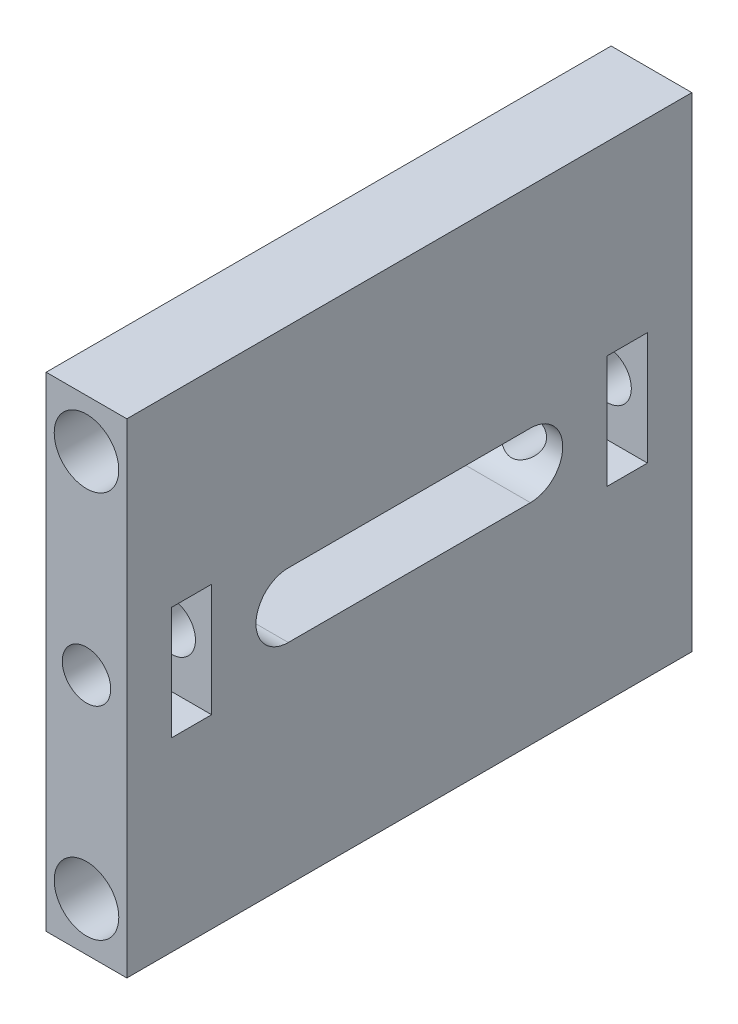
ISO-10303-21;
HEADER;
FILE_DESCRIPTION(('STEP AP214'),'2;1');
FILE_NAME('part.step','',(''),(''),'','','');
FILE_SCHEMA(('AUTOMOTIVE_DESIGN { 1 0 10303 214 1 1 1 1 }'));
ENDSEC;
DATA;
#1=APPLICATION_CONTEXT('core data for automotive mechanical design processes');
#2=APPLICATION_PROTOCOL_DEFINITION('international standard','automotive_design',2000,#1);
#3=PRODUCT_CONTEXT('',#1,'mechanical');
#4=PRODUCT('Part','Part','',(#3));
#5=PRODUCT_RELATED_PRODUCT_CATEGORY('part','',(#4));
#6=PRODUCT_DEFINITION_FORMATION('','',#4);
#7=PRODUCT_DEFINITION_CONTEXT('part definition',#1,'design');
#8=PRODUCT_DEFINITION('design','',#6,#7);
#9=PRODUCT_DEFINITION_SHAPE('','',#8);
#10=(LENGTH_UNIT() NAMED_UNIT(*) SI_UNIT(.MILLI.,.METRE.));
#11=(NAMED_UNIT(*) PLANE_ANGLE_UNIT() SI_UNIT($,.RADIAN.));
#12=(NAMED_UNIT(*) SI_UNIT($,.STERADIAN.) SOLID_ANGLE_UNIT());
#13=UNCERTAINTY_MEASURE_WITH_UNIT(LENGTH_MEASURE(1.E-05),#10,'distance_accuracy_value','');
#14=(GEOMETRIC_REPRESENTATION_CONTEXT(3) GLOBAL_UNCERTAINTY_ASSIGNED_CONTEXT((#13)) GLOBAL_UNIT_ASSIGNED_CONTEXT((#10,
#11,#12)) REPRESENTATION_CONTEXT('',''));
#15=CARTESIAN_POINT('',(0.,0.,0.));
#16=DIRECTION('',(0.,0.,1.));
#17=DIRECTION('',(1.,0.,0.));
#18=AXIS2_PLACEMENT_3D('',#15,#16,#17);
#19=CARTESIAN_POINT('',(2.5,-15.,35.));
#20=DIRECTION('',(-1.,0.,0.));
#21=DIRECTION('',(0.,0.,1.));
#22=AXIS2_PLACEMENT_3D('',#19,#20,#21);
#23=PLANE('',#22);
#24=DIRECTION('',(0.,1.,0.));
#25=VECTOR('',#24,1.);
#26=CARTESIAN_POINT('',(2.5,-15.,0.));
#27=LINE('',#26,#25);
#28=CARTESIAN_POINT('',(2.5,-15.,0.));
#29=VERTEX_POINT('',#28);
#30=CARTESIAN_POINT('',(2.5,15.,0.));
#31=VERTEX_POINT('',#30);
#32=EDGE_CURVE('E277',#29,#31,#27,.T.);
#33=ORIENTED_EDGE('',*,*,#32,.T.);
#34=DIRECTION('',(0.,0.,-1.));
#35=VECTOR('',#34,1.);
#36=CARTESIAN_POINT('',(2.5,15.,35.));
#37=LINE('',#36,#35);
#38=CARTESIAN_POINT('',(2.5,15.,35.));
#39=VERTEX_POINT('',#38);
#40=EDGE_CURVE('E247',#39,#31,#37,.T.);
#41=ORIENTED_EDGE('',*,*,#40,.F.);
#42=DIRECTION('',(0.,1.,0.));
#43=VECTOR('',#42,1.);
#44=CARTESIAN_POINT('',(2.5,-15.,35.));
#45=LINE('',#44,#43);
#46=CARTESIAN_POINT('',(2.5,-15.,35.));
#47=VERTEX_POINT('',#46);
#48=EDGE_CURVE('E362',#47,#39,#45,.T.);
#49=ORIENTED_EDGE('',*,*,#48,.F.);
#50=DIRECTION('',(0.,0.,-1.));
#51=VECTOR('',#50,1.);
#52=CARTESIAN_POINT('',(2.5,-15.,35.));
#53=LINE('',#52,#51);
#54=EDGE_CURVE('E378',#47,#29,#53,.T.);
#55=ORIENTED_EDGE('',*,*,#54,.T.);
#56=EDGE_LOOP('',(#33,#41,#49,#55));
#57=FACE_BOUND('',#56,.T.);
#58=DIRECTION('',(0.,0.,1.));
#59=VECTOR('',#58,1.);
#60=CARTESIAN_POINT('',(2.5,2.,10.));
#61=LINE('',#60,#59);
#62=CARTESIAN_POINT('',(2.5,2.,10.));
#63=VERTEX_POINT('',#62);
#64=CARTESIAN_POINT('',(2.5,1.99999999999999,25.));
#65=VERTEX_POINT('',#64);
#66=EDGE_CURVE('E282',#63,#65,#61,.T.);
#67=ORIENTED_EDGE('',*,*,#66,.F.);
#68=CARTESIAN_POINT('',(2.5,0.,10.));
#69=DIRECTION('',(1.,0.,0.));
#70=DIRECTION('',(0.,0.,-1.));
#71=AXIS2_PLACEMENT_3D('',#68,#69,#70);
#72=CIRCLE('',#71,2.);
#73=CARTESIAN_POINT('',(2.5,-2.,10.));
#74=VERTEX_POINT('',#73);
#75=EDGE_CURVE('E410',#74,#63,#72,.T.);
#76=ORIENTED_EDGE('',*,*,#75,.F.);
#77=DIRECTION('',(0.,0.,-1.));
#78=VECTOR('',#77,1.);
#79=CARTESIAN_POINT('',(2.5,-2.,10.));
#80=LINE('',#79,#78);
#81=CARTESIAN_POINT('',(2.5,-2.00000000000001,25.));
#82=VERTEX_POINT('',#81);
#83=EDGE_CURVE('E402',#82,#74,#80,.T.);
#84=ORIENTED_EDGE('',*,*,#83,.F.);
#85=CARTESIAN_POINT('',(2.5,0.,25.));
#86=DIRECTION('',(1.,0.,0.));
#87=DIRECTION('',(0.,0.,-1.));
#88=AXIS2_PLACEMENT_3D('',#85,#86,#87);
#89=CIRCLE('',#88,2.);
#90=EDGE_CURVE('E406',#65,#82,#89,.T.);
#91=ORIENTED_EDGE('',*,*,#90,.F.);
#92=EDGE_LOOP('',(#67,#76,#84,#91));
#93=FACE_BOUND('',#92,.T.);
#94=DIRECTION('',(0.,0.,-1.));
#95=VECTOR('',#94,1.);
#96=CARTESIAN_POINT('',(2.5,-3.5,29.75));
#97=LINE('',#96,#95);
#98=CARTESIAN_POINT('',(2.5,-3.5,32.25));
#99=VERTEX_POINT('',#98);
#100=CARTESIAN_POINT('',(2.5,-3.5,29.75));
#101=VERTEX_POINT('',#100);
#102=EDGE_CURVE('E176',#99,#101,#97,.T.);
#103=ORIENTED_EDGE('',*,*,#102,.F.);
#104=DIRECTION('',(0.,-1.,0.));
#105=VECTOR('',#104,1.);
#106=CARTESIAN_POINT('',(2.5,-3.5,32.25));
#107=LINE('',#106,#105);
#108=CARTESIAN_POINT('',(2.5,3.5,32.25));
#109=VERTEX_POINT('',#108);
#110=EDGE_CURVE('E174',#109,#99,#107,.T.);
#111=ORIENTED_EDGE('',*,*,#110,.F.);
#112=DIRECTION('',(0.,0.,1.));
#113=VECTOR('',#112,1.);
#114=CARTESIAN_POINT('',(2.5,3.5,29.75));
#115=LINE('',#114,#113);
#116=CARTESIAN_POINT('',(2.5,3.5,29.75));
#117=VERTEX_POINT('',#116);
#118=EDGE_CURVE('E182',#117,#109,#115,.T.);
#119=ORIENTED_EDGE('',*,*,#118,.F.);
#120=DIRECTION('',(0.,1.,0.));
#121=VECTOR('',#120,1.);
#122=CARTESIAN_POINT('',(2.5,-3.5,29.75));
#123=LINE('',#122,#121);
#124=EDGE_CURVE('E179',#101,#117,#123,.T.);
#125=ORIENTED_EDGE('',*,*,#124,.F.);
#126=EDGE_LOOP('',(#103,#111,#119,#125));
#127=FACE_BOUND('',#126,.T.);
#128=DIRECTION('',(0.,-1.,0.));
#129=VECTOR('',#128,1.);
#130=CARTESIAN_POINT('',(2.5,-3.5,2.75));
#131=LINE('',#130,#129);
#132=CARTESIAN_POINT('',(2.5,3.5,2.75));
#133=VERTEX_POINT('',#132);
#134=CARTESIAN_POINT('',(2.5,-3.5,2.75));
#135=VERTEX_POINT('',#134);
#136=EDGE_CURVE('E46',#133,#135,#131,.T.);
#137=ORIENTED_EDGE('',*,*,#136,.T.);
#138=DIRECTION('',(0.,0.,1.));
#139=VECTOR('',#138,1.);
#140=CARTESIAN_POINT('',(2.5,-3.5,5.25));
#141=LINE('',#140,#139);
#142=CARTESIAN_POINT('',(2.5,-3.5,5.25));
#143=VERTEX_POINT('',#142);
#144=EDGE_CURVE('E160',#135,#143,#141,.T.);
#145=ORIENTED_EDGE('',*,*,#144,.T.);
#146=DIRECTION('',(0.,1.,0.));
#147=VECTOR('',#146,1.);
#148=CARTESIAN_POINT('',(2.5,-3.5,5.25));
#149=LINE('',#148,#147);
#150=CARTESIAN_POINT('',(2.5,3.5,5.25));
#151=VERTEX_POINT('',#150);
#152=EDGE_CURVE('E146',#143,#151,#149,.T.);
#153=ORIENTED_EDGE('',*,*,#152,.T.);
#154=DIRECTION('',(0.,0.,-1.));
#155=VECTOR('',#154,1.);
#156=CARTESIAN_POINT('',(2.5,3.5,5.25));
#157=LINE('',#156,#155);
#158=EDGE_CURVE('E155',#151,#133,#157,.T.);
#159=ORIENTED_EDGE('',*,*,#158,.T.);
#160=EDGE_LOOP('',(#137,#145,#153,#159));
#161=FACE_BOUND('',#160,.T.);
#162=ADVANCED_FACE('F32',(#57,#93,#127,#161),#23,.F.);
#163=CARTESIAN_POINT('',(-2.5,-15.,35.));
#164=DIRECTION('',(1.,0.,0.));
#165=DIRECTION('',(0.,0.,-1.));
#166=AXIS2_PLACEMENT_3D('',#163,#164,#165);
#167=PLANE('',#166);
#168=DIRECTION('',(0.,-1.,0.));
#169=VECTOR('',#168,1.);
#170=CARTESIAN_POINT('',(-2.5,-15.,0.));
#171=LINE('',#170,#169);
#172=CARTESIAN_POINT('',(-2.5,15.,0.));
#173=VERTEX_POINT('',#172);
#174=CARTESIAN_POINT('',(-2.5,-15.,0.));
#175=VERTEX_POINT('',#174);
#176=EDGE_CURVE('E383',#173,#175,#171,.T.);
#177=ORIENTED_EDGE('',*,*,#176,.T.);
#178=DIRECTION('',(0.,0.,-1.));
#179=VECTOR('',#178,1.);
#180=CARTESIAN_POINT('',(-2.5,-15.,35.));
#181=LINE('',#180,#179);
#182=CARTESIAN_POINT('',(-2.5,-15.,35.));
#183=VERTEX_POINT('',#182);
#184=EDGE_CURVE('E374',#183,#175,#181,.T.);
#185=ORIENTED_EDGE('',*,*,#184,.F.);
#186=DIRECTION('',(0.,-1.,0.));
#187=VECTOR('',#186,1.);
#188=CARTESIAN_POINT('',(-2.5,-15.,35.));
#189=LINE('',#188,#187);
#190=CARTESIAN_POINT('',(-2.5,15.,35.));
#191=VERTEX_POINT('',#190);
#192=EDGE_CURVE('E390',#191,#183,#189,.T.);
#193=ORIENTED_EDGE('',*,*,#192,.F.);
#194=DIRECTION('',(0.,0.,-1.));
#195=VECTOR('',#194,1.);
#196=CARTESIAN_POINT('',(-2.5,15.,35.));
#197=LINE('',#196,#195);
#198=EDGE_CURVE('E372',#191,#173,#197,.T.);
#199=ORIENTED_EDGE('',*,*,#198,.T.);
#200=EDGE_LOOP('',(#177,#185,#193,#199));
#201=FACE_BOUND('',#200,.T.);
#202=DIRECTION('',(0.,0.,-1.));
#203=VECTOR('',#202,1.);
#204=CARTESIAN_POINT('',(-2.5,-2.,10.));
#205=LINE('',#204,#203);
#206=CARTESIAN_POINT('',(-2.5,-2.00000000000001,25.));
#207=VERTEX_POINT('',#206);
#208=CARTESIAN_POINT('',(-2.5,-2.,10.));
#209=VERTEX_POINT('',#208);
#210=EDGE_CURVE('E397',#207,#209,#205,.T.);
#211=ORIENTED_EDGE('',*,*,#210,.T.);
#212=CARTESIAN_POINT('',(-2.5,0.,10.));
#213=DIRECTION('',(1.,0.,0.));
#214=DIRECTION('',(0.,0.,-1.));
#215=AXIS2_PLACEMENT_3D('',#212,#213,#214);
#216=CIRCLE('',#215,2.);
#217=CARTESIAN_POINT('',(-2.5,2.,10.));
#218=VERTEX_POINT('',#217);
#219=EDGE_CURVE('E405',#209,#218,#216,.T.);
#220=ORIENTED_EDGE('',*,*,#219,.T.);
#221=DIRECTION('',(0.,0.,1.));
#222=VECTOR('',#221,1.);
#223=CARTESIAN_POINT('',(-2.5,2.,10.));
#224=LINE('',#223,#222);
#225=CARTESIAN_POINT('',(-2.5,1.99999999999999,25.));
#226=VERTEX_POINT('',#225);
#227=EDGE_CURVE('E418',#218,#226,#224,.T.);
#228=ORIENTED_EDGE('',*,*,#227,.T.);
#229=CARTESIAN_POINT('',(-2.5,0.,25.));
#230=DIRECTION('',(1.,0.,0.));
#231=DIRECTION('',(0.,0.,-1.));
#232=AXIS2_PLACEMENT_3D('',#229,#230,#231);
#233=CIRCLE('',#232,2.);
#234=EDGE_CURVE('E415',#226,#207,#233,.T.);
#235=ORIENTED_EDGE('',*,*,#234,.T.);
#236=EDGE_LOOP('',(#211,#220,#228,#235));
#237=FACE_BOUND('',#236,.T.);
#238=DIRECTION('',(0.,0.,1.));
#239=VECTOR('',#238,1.);
#240=CARTESIAN_POINT('',(-2.5,3.5,35.));
#241=LINE('',#240,#239);
#242=CARTESIAN_POINT('',(-2.5,3.5,29.75));
#243=VERTEX_POINT('',#242);
#244=CARTESIAN_POINT('',(-2.5,3.5,32.25));
#245=VERTEX_POINT('',#244);
#246=EDGE_CURVE('E299',#243,#245,#241,.T.);
#247=ORIENTED_EDGE('',*,*,#246,.T.);
#248=DIRECTION('',(0.,-1.,0.));
#249=VECTOR('',#248,1.);
#250=CARTESIAN_POINT('',(-2.5,-15.,32.25));
#251=LINE('',#250,#249);
#252=CARTESIAN_POINT('',(-2.5,-3.5,32.25));
#253=VERTEX_POINT('',#252);
#254=EDGE_CURVE('E199',#245,#253,#251,.T.);
#255=ORIENTED_EDGE('',*,*,#254,.T.);
#256=DIRECTION('',(0.,0.,-1.));
#257=VECTOR('',#256,1.);
#258=CARTESIAN_POINT('',(-2.5,-3.5,35.));
#259=LINE('',#258,#257);
#260=CARTESIAN_POINT('',(-2.5,-3.5,29.75));
#261=VERTEX_POINT('',#260);
#262=EDGE_CURVE('E292',#253,#261,#259,.T.);
#263=ORIENTED_EDGE('',*,*,#262,.T.);
#264=DIRECTION('',(0.,1.,0.));
#265=VECTOR('',#264,1.);
#266=CARTESIAN_POINT('',(-2.5,-15.,29.75));
#267=LINE('',#266,#265);
#268=EDGE_CURVE('E195',#261,#243,#267,.T.);
#269=ORIENTED_EDGE('',*,*,#268,.T.);
#270=EDGE_LOOP('',(#247,#255,#263,#269));
#271=FACE_BOUND('',#270,.T.);
#272=DIRECTION('',(0.,-1.,0.));
#273=VECTOR('',#272,1.);
#274=CARTESIAN_POINT('',(-2.5,-15.,2.75));
#275=LINE('',#274,#273);
#276=CARTESIAN_POINT('',(-2.5,3.5,2.75));
#277=VERTEX_POINT('',#276);
#278=CARTESIAN_POINT('',(-2.5,-3.5,2.75));
#279=VERTEX_POINT('',#278);
#280=EDGE_CURVE('E172',#277,#279,#275,.T.);
#281=ORIENTED_EDGE('',*,*,#280,.F.);
#282=DIRECTION('',(0.,0.,-1.));
#283=VECTOR('',#282,1.);
#284=CARTESIAN_POINT('',(-2.5,3.5,35.));
#285=LINE('',#284,#283);
#286=CARTESIAN_POINT('',(-2.5,3.5,5.25));
#287=VERTEX_POINT('',#286);
#288=EDGE_CURVE('E39',#287,#277,#285,.T.);
#289=ORIENTED_EDGE('',*,*,#288,.F.);
#290=DIRECTION('',(0.,1.,0.));
#291=VECTOR('',#290,1.);
#292=CARTESIAN_POINT('',(-2.5,-15.,5.25));
#293=LINE('',#292,#291);
#294=CARTESIAN_POINT('',(-2.5,-3.5,5.25));
#295=VERTEX_POINT('',#294);
#296=EDGE_CURVE('E149',#295,#287,#293,.T.);
#297=ORIENTED_EDGE('',*,*,#296,.F.);
#298=DIRECTION('',(0.,0.,1.));
#299=VECTOR('',#298,1.);
#300=CARTESIAN_POINT('',(-2.5,-3.49999999999999,35.));
#301=LINE('',#300,#299);
#302=EDGE_CURVE('E11',#279,#295,#301,.T.);
#303=ORIENTED_EDGE('',*,*,#302,.F.);
#304=EDGE_LOOP('',(#281,#289,#297,#303));
#305=FACE_BOUND('',#304,.T.);
#306=ADVANCED_FACE('F232',(#201,#237,#271,#305),#167,.F.);
#307=CARTESIAN_POINT('',(0.,0.,-5.));
#308=DIRECTION('',(0.,0.,1.));
#309=DIRECTION('',(1.,0.,0.));
#310=AXIS2_PLACEMENT_3D('',#307,#308,#309);
#311=CYLINDRICAL_SURFACE('',#310,1.5);
#312=CARTESIAN_POINT('',(0.,0.,0.));
#313=DIRECTION('',(0.,0.,-1.));
#314=DIRECTION('',(-1.,0.,0.));
#315=AXIS2_PLACEMENT_3D('',#312,#313,#314);
#316=CIRCLE('',#315,1.5);
#317=CARTESIAN_POINT('',(-1.5,0.,0.));
#318=VERTEX_POINT('',#317);
#319=EDGE_CURVE('E220',#318,#318,#316,.T.);
#320=ORIENTED_EDGE('',*,*,#319,.T.);
#321=EDGE_LOOP('',(#320));
#322=FACE_BOUND('',#321,.T.);
#323=CARTESIAN_POINT('',(0.,0.,2.75));
#324=DIRECTION('',(0.,0.,1.));
#325=DIRECTION('',(1.,0.,0.));
#326=AXIS2_PLACEMENT_3D('',#323,#324,#325);
#327=CIRCLE('',#326,1.5);
#328=CARTESIAN_POINT('',(1.5,0.,2.75));
#329=VERTEX_POINT('',#328);
#330=EDGE_CURVE('E171',#329,#329,#327,.F.);
#331=ORIENTED_EDGE('',*,*,#330,.F.);
#332=EDGE_LOOP('',(#331));
#333=FACE_BOUND('',#332,.T.);
#334=ADVANCED_FACE('F226',(#322,#333),#311,.F.);
#335=CARTESIAN_POINT('',(1.5,0.,8.));
#336=CARTESIAN_POINT('',(1.49999520798798,-0.0732207358411543,8.00000459803605));
#337=CARTESIAN_POINT('',(1.4945949756255,-0.146561062021485,8.00406354473726));
#338=CARTESIAN_POINT('',(1.47333293658984,-0.290936396286467,8.01993392718917));
#339=CARTESIAN_POINT('',(1.45744482834995,-0.361965136229004,8.03176485320146));
#340=CARTESIAN_POINT('',(1.41628709071623,-0.499234626631249,8.0620432504394));
#341=CARTESIAN_POINT('',(1.39107448643083,-0.565501615403737,8.08045048067991));
#342=CARTESIAN_POINT('',(1.33245765581277,-0.692422335520753,8.12249443278307));
#343=CARTESIAN_POINT('',(1.29905582580648,-0.753077701796332,8.14612962464517));
#344=CARTESIAN_POINT('',(1.22173698840918,-0.873465937590145,8.19950455456017));
#345=CARTESIAN_POINT('',(1.17713267066593,-0.932593229272032,8.22960691451561));
#346=CARTESIAN_POINT('',(1.08050416263883,-1.04302716767671,8.29232982116623));
#347=CARTESIAN_POINT('',(1.02846851720017,-1.09432148272226,8.32495421921391));
#348=CARTESIAN_POINT('',(0.906417046721634,-1.19837161436623,8.3972887634801));
#349=CARTESIAN_POINT('',(0.834896322878297,-1.24930578421204,8.43709145135361));
#350=CARTESIAN_POINT('',(0.682548987633455,-1.33861998176348,8.51288555335865));
#351=CARTESIAN_POINT('',(0.601735302999691,-1.37701716983077,8.54888213116325));
#352=CARTESIAN_POINT('',(0.460497161323767,-1.42880627811788,8.60022844819821));
#353=CARTESIAN_POINT('',(0.402609302871619,-1.44625674456539,8.61842248813267));
#354=CARTESIAN_POINT('',(0.283607265215081,-1.47420672564844,8.64828405849315));
#355=CARTESIAN_POINT('',(0.22250082212521,-1.48472215355267,8.65996652089168));
#356=CARTESIAN_POINT('',(0.097817414469232,-1.49812822141445,8.67496240315447));
#357=CARTESIAN_POINT('',(0.0342231932759448,-1.50094954854207,8.67819973323403));
#358=CARTESIAN_POINT('',(-0.0926149108815747,-1.49848213241869,8.67540468223932));
#359=CARTESIAN_POINT('',(-0.155858660087439,-1.49319048157349,8.66936897781887));
#360=CARTESIAN_POINT('',(-0.273191347425791,-1.47597739291882,8.65032376737481));
#361=CARTESIAN_POINT('',(-0.327536371046185,-1.46482486380817,8.63812842940129));
#362=CARTESIAN_POINT('',(-0.433438878720878,-1.43705671120732,8.60885807155061));
#363=CARTESIAN_POINT('',(-0.484993627823596,-1.42043583681172,8.59177836359231));
#364=CARTESIAN_POINT('',(-0.61625638663415,-1.37033064172535,8.54258230705694));
#365=CARTESIAN_POINT('',(-0.69340041664351,-1.3328014849398,8.50774350860767));
#366=CARTESIAN_POINT('',(-0.839196523869085,-1.24618023314519,8.43466701854804));
#367=CARTESIAN_POINT('',(-0.90782733925466,-1.19706004255878,8.39642121113891));
#368=CARTESIAN_POINT('',(-1.03775339040365,-1.08651604102135,8.31948327686855));
#369=CARTESIAN_POINT('',(-1.09882060688148,-1.02481375526036,8.28080413269761));
#370=CARTESIAN_POINT('',(-1.21026364678116,-0.890422521709589,8.20751962019028));
#371=CARTESIAN_POINT('',(-1.26065992023038,-0.817755054293756,8.1729065173624));
#372=CARTESIAN_POINT('',(-1.33998079924033,-0.677902080454142,8.11720273926357));
#373=CARTESIAN_POINT('',(-1.37118459421578,-0.61253987018562,8.09479229054992));
#374=CARTESIAN_POINT('',(-1.42422488046387,-0.476352173202086,8.05627095583053));
#375=CARTESIAN_POINT('',(-1.44606723849928,-0.405530141063766,8.04015612495649));
#376=CARTESIAN_POINT('',(-1.47925336288644,-0.259676232483518,8.01554411364011));
#377=CARTESIAN_POINT('',(-1.49053217893863,-0.184621281405942,8.00709407028251));
#378=CARTESIAN_POINT('',(-1.50154959737171,-0.0332012397969168,7.99884116340556));
#379=CARTESIAN_POINT('',(-1.50129306869537,0.0431632843727239,7.99903465154593));
#380=CARTESIAN_POINT('',(-1.48988913072681,0.186804217329626,8.00757452824127));
#381=CARTESIAN_POINT('',(-1.47983946311133,0.254222327546134,8.01509913399599));
#382=CARTESIAN_POINT('',(-1.45102621999213,0.386110670609119,8.03648679798412));
#383=CARTESIAN_POINT('',(-1.43226079031059,0.450580272987262,8.05035120492738));
#384=CARTESIAN_POINT('',(-1.3861124694069,0.57741677968977,8.08400169316687));
#385=CARTESIAN_POINT('',(-1.3584488185726,0.639629172536139,8.10397949709807));
#386=CARTESIAN_POINT('',(-1.29582754457441,0.758518527043074,8.14833014588038));
#387=CARTESIAN_POINT('',(-1.26086891236026,0.815194721336404,8.17270359867933));
#388=CARTESIAN_POINT('',(-1.17821675358944,0.931511626319037,8.22880853113501));
#389=CARTESIAN_POINT('',(-1.12937146056254,0.990066762698702,8.26108904974963));
#390=CARTESIAN_POINT('',(-1.02399124741161,1.09871974855854,8.32761047125216));
#391=CARTESIAN_POINT('',(-0.967439300306641,1.14879830469577,8.36185561492605));
#392=CARTESIAN_POINT('',(-0.835850119038823,1.24877541075626,8.43630871708504));
#393=CARTESIAN_POINT('',(-0.759342438507698,1.29683043648705,8.476412814799));
#394=CARTESIAN_POINT('',(-0.596639922027546,1.37923235998283,8.5505940865155));
#395=CARTESIAN_POINT('',(-0.510474878091424,1.41362000515519,8.58468900429031));
#396=CARTESIAN_POINT('',(-0.364585551125523,1.45615734256767,8.62881122191418));
#397=CARTESIAN_POINT('',(-0.307608873597617,1.46931009512996,8.64304188175436));
#398=CARTESIAN_POINT('',(-0.191292953016817,1.48891522181906,8.6645794389699));
#399=CARTESIAN_POINT('',(-0.131959293197747,1.4953825519924,8.67190178779767));
#400=CARTESIAN_POINT('',(-0.0121709201886699,1.50115320209064,8.67842398207792));
#401=CARTESIAN_POINT('',(0.0482879430095738,1.50042015325262,8.67758259315025));
#402=CARTESIAN_POINT('',(0.168056838752158,1.49176883838219,8.66783551456334));
#403=CARTESIAN_POINT('',(0.227365287897259,1.48384130024584,8.65891941842517));
#404=CARTESIAN_POINT('',(0.355914571410801,1.45893841819723,8.63182651202228));
#405=CARTESIAN_POINT('',(0.424497180132775,1.44036567954111,8.61205294049357));
#406=CARTESIAN_POINT('',(0.556534848830485,1.39469627266119,8.5661703661459));
#407=CARTESIAN_POINT('',(0.619976442038189,1.3675780729773,8.5400453985307));
#408=CARTESIAN_POINT('',(0.762520630486334,1.29498918933642,8.47483522671177));
#409=CARTESIAN_POINT('',(0.839421582755755,1.2464154206597,8.43439796808895));
#410=CARTESIAN_POINT('',(0.983126044977566,1.13650718465936,8.35286489818727));
#411=CARTESIAN_POINT('',(1.04992046594485,1.07516134758577,8.31176853045778));
#412=CARTESIAN_POINT('',(1.17283184228333,0.93962714493789,8.23271011060207));
#413=CARTESIAN_POINT('',(1.2288563193772,0.865337161562859,8.19477666288928));
#414=CARTESIAN_POINT('',(1.32722305114535,0.705159098936202,8.12642710331903));
#415=CARTESIAN_POINT('',(1.36959797457251,0.619299420401793,8.09599308407041));
#416=CARTESIAN_POINT('',(1.42779942098571,0.464840290356453,8.05363295375953));
#417=CARTESIAN_POINT('',(1.44776673137618,0.398553614774731,8.03889677500282));
#418=CARTESIAN_POINT('',(1.47841790261149,0.262841610392758,8.01616260029763));
#419=CARTESIAN_POINT('',(1.48912769024996,0.193425623834904,8.00814578789106));
#420=CARTESIAN_POINT('',(1.49660469421435,0.102963309861887,8.00254528293691));
#421=CARTESIAN_POINT('',(1.49787627748942,0.0824069459941224,8.0015923856792));
#422=CARTESIAN_POINT('',(1.49957467323097,0.0412368896243777,8.00031904576862));
#423=CARTESIAN_POINT('',(1.50000134970737,0.0206231884283878,7.99999870492747));
#424=CARTESIAN_POINT('',(1.5,0.,8.));
#425=B_SPLINE_CURVE_WITH_KNOTS('',3,(#335,#336,#337,#338,#339,#340,#341,#342,#343,#344,#345,
#346,#347,#348,#349,#350,#351,#352,#353,#354,#355,#356,#357,#358,#359,#360,#361,#362,#363,#364,
#365,#366,#367,#368,#369,#370,#371,#372,#373,#374,#375,#376,#377,#378,#379,#380,#381,#382,#383,
#384,#385,#386,#387,#388,#389,#390,#391,#392,#393,#394,#395,#396,#397,#398,#399,#400,#401,#402,
#403,#404,#405,#406,#407,#408,#409,#410,#411,#412,#413,#414,#415,#416,#417,#418,#419,#420,#421,
#422,#423,#424),.UNSPECIFIED.,.T.,.F.,(4,2,2,2,2,2,2,2,2,2,2,2,2,2,2,2,2,2,2,2,2,2,2,2,2,2,2,2,
2,2,2,2,2,2,2,2,2,2,2,2,2,2,2,2,4),(0.,0.219571786572042,0.439696319423244,0.658496333573381,
0.877232398849293,1.1162243131743,1.35558868405162,1.64360015887451,1.93121574056507,
2.11999518529901,2.3083399319529,2.49837587621257,2.6884799430021,2.85826890162709,
3.0282213760064,3.3044933180591,3.58144192357889,3.86535883938091,4.14872662493691,
4.37526505006389,4.60166129643117,4.82944058166899,5.05712372466613,5.26191187011994,
5.46674360185812,5.6788043948368,5.89089453977541,6.13840382081868,6.38646908985452,
6.68168596015947,6.97601595850113,7.15589161422933,7.33536399114209,7.51574333854741,
7.69635548563854,7.91639670960135,8.13699685139922,8.43412246655768,8.73151372390893,
9.0313544949265,9.33047220273164,9.5419569754163,9.75284752283257,9.81468166878711,
9.87652576630966),.UNSPECIFIED.);
#426=CARTESIAN_POINT('',(1.5,0.,8.));
#427=VERTEX_POINT('',#426);
#428=EDGE_CURVE('E212',#427,#427,#425,.T.);
#429=ORIENTED_EDGE('',*,*,#428,.F.);
#430=EDGE_LOOP('',(#429));
#431=FACE_BOUND('',#430,.T.);
#432=CARTESIAN_POINT('',(0.,0.,5.25));
#433=DIRECTION('',(0.,0.,-1.));
#434=DIRECTION('',(-1.,0.,0.));
#435=AXIS2_PLACEMENT_3D('',#432,#433,#434);
#436=CIRCLE('',#435,1.5);
#437=CARTESIAN_POINT('',(-1.5,0.,5.25));
#438=VERTEX_POINT('',#437);
#439=EDGE_CURVE('E167',#438,#438,#436,.F.);
#440=ORIENTED_EDGE('',*,*,#439,.F.);
#441=EDGE_LOOP('',(#440));
#442=FACE_BOUND('',#441,.T.);
#443=ADVANCED_FACE('F231',(#431,#442),#311,.F.);
#444=CARTESIAN_POINT('',(0.,0.,32.25));
#445=DIRECTION('',(0.,0.,1.));
#446=DIRECTION('',(1.,0.,0.));
#447=AXIS2_PLACEMENT_3D('',#444,#445,#446);
#448=CIRCLE('',#447,1.5);
#449=CARTESIAN_POINT('',(1.5,0.,32.25));
#450=VERTEX_POINT('',#449);
#451=EDGE_CURVE('E198',#450,#450,#448,.F.);
#452=ORIENTED_EDGE('',*,*,#451,.T.);
#453=EDGE_LOOP('',(#452));
#454=FACE_BOUND('',#453,.T.);
#455=CARTESIAN_POINT('',(0.,0.,35.));
#456=DIRECTION('',(0.,0.,1.));
#457=DIRECTION('',(1.,0.,0.));
#458=AXIS2_PLACEMENT_3D('',#455,#456,#457);
#459=CIRCLE('',#458,1.5);
#460=CARTESIAN_POINT('',(1.5,0.,35.));
#461=VERTEX_POINT('',#460);
#462=EDGE_CURVE('E206',#461,#461,#459,.T.);
#463=ORIENTED_EDGE('',*,*,#462,.T.);
#464=EDGE_LOOP('',(#463));
#465=FACE_BOUND('',#464,.T.);
#466=ADVANCED_FACE('F263',(#454,#465),#311,.F.);
#467=CARTESIAN_POINT('',(-2.5,15.,35.));
#468=DIRECTION('',(0.,-1.,0.));
#469=DIRECTION('',(0.,0.,-1.));
#470=AXIS2_PLACEMENT_3D('',#467,#468,#469);
#471=PLANE('',#470);
#472=DIRECTION('',(-1.,0.,0.));
#473=VECTOR('',#472,1.);
#474=CARTESIAN_POINT('',(-2.5,15.,0.));
#475=LINE('',#474,#473);
#476=EDGE_CURVE('E385',#31,#173,#475,.T.);
#477=ORIENTED_EDGE('',*,*,#476,.T.);
#478=ORIENTED_EDGE('',*,*,#198,.F.);
#479=DIRECTION('',(-1.,0.,0.));
#480=VECTOR('',#479,1.);
#481=CARTESIAN_POINT('',(-2.5,15.,35.));
#482=LINE('',#481,#480);
#483=EDGE_CURVE('E363',#39,#191,#482,.T.);
#484=ORIENTED_EDGE('',*,*,#483,.F.);
#485=ORIENTED_EDGE('',*,*,#40,.T.);
#486=EDGE_LOOP('',(#477,#478,#484,#485));
#487=FACE_BOUND('',#486,.T.);
#488=ADVANCED_FACE('F448',(#487),#471,.F.);
#489=CARTESIAN_POINT('',(-2.5,-15.,35.));
#490=DIRECTION('',(0.,1.,0.));
#491=DIRECTION('',(0.,0.,1.));
#492=AXIS2_PLACEMENT_3D('',#489,#490,#491);
#493=PLANE('',#492);
#494=DIRECTION('',(1.,0.,0.));
#495=VECTOR('',#494,1.);
#496=CARTESIAN_POINT('',(-2.5,-15.,0.));
#497=LINE('',#496,#495);
#498=EDGE_CURVE('E368',#175,#29,#497,.T.);
#499=ORIENTED_EDGE('',*,*,#498,.T.);
#500=ORIENTED_EDGE('',*,*,#54,.F.);
#501=DIRECTION('',(1.,0.,0.));
#502=VECTOR('',#501,1.);
#503=CARTESIAN_POINT('',(-2.5,-15.,35.));
#504=LINE('',#503,#502);
#505=EDGE_CURVE('E366',#183,#47,#504,.T.);
#506=ORIENTED_EDGE('',*,*,#505,.F.);
#507=ORIENTED_EDGE('',*,*,#184,.T.);
#508=EDGE_LOOP('',(#499,#500,#506,#507));
#509=FACE_BOUND('',#508,.T.);
#510=ADVANCED_FACE('F356',(#509),#493,.F.);
#511=CARTESIAN_POINT('',(0.,0.,35.));
#512=DIRECTION('',(0.,0.,-1.));
#513=DIRECTION('',(-1.,0.,0.));
#514=AXIS2_PLACEMENT_3D('',#511,#512,#513);
#515=PLANE('',#514);
#516=CARTESIAN_POINT('',(0.,12.,35.));
#517=DIRECTION('',(0.,0.,1.));
#518=DIRECTION('',(-1.,0.,0.));
#519=AXIS2_PLACEMENT_3D('',#516,#517,#518);
#520=CIRCLE('',#519,2.);
#521=CARTESIAN_POINT('',(-2.,12.,35.));
#522=VERTEX_POINT('',#521);
#523=EDGE_CURVE('E202',#522,#522,#520,.T.);
#524=ORIENTED_EDGE('',*,*,#523,.F.);
#525=EDGE_LOOP('',(#524));
#526=FACE_BOUND('',#525,.T.);
#527=CARTESIAN_POINT('',(0.,-12.,35.));
#528=DIRECTION('',(0.,0.,1.));
#529=DIRECTION('',(1.,0.,0.));
#530=AXIS2_PLACEMENT_3D('',#527,#528,#529);
#531=CIRCLE('',#530,2.);
#532=CARTESIAN_POINT('',(2.,-12.,35.));
#533=VERTEX_POINT('',#532);
#534=EDGE_CURVE('E203',#533,#533,#531,.T.);
#535=ORIENTED_EDGE('',*,*,#534,.F.);
#536=EDGE_LOOP('',(#535));
#537=FACE_BOUND('',#536,.T.);
#538=ORIENTED_EDGE('',*,*,#462,.F.);
#539=EDGE_LOOP('',(#538));
#540=FACE_BOUND('',#539,.T.);
#541=ORIENTED_EDGE('',*,*,#48,.T.);
#542=ORIENTED_EDGE('',*,*,#483,.T.);
#543=ORIENTED_EDGE('',*,*,#192,.T.);
#544=ORIENTED_EDGE('',*,*,#505,.T.);
#545=EDGE_LOOP('',(#541,#542,#543,#544));
#546=FACE_BOUND('',#545,.T.);
#547=ADVANCED_FACE('F352',(#526,#537,#540,#546),#515,.F.);
#548=CARTESIAN_POINT('',(0.,0.,0.));
#549=DIRECTION('',(0.,0.,-1.));
#550=DIRECTION('',(-1.,0.,0.));
#551=AXIS2_PLACEMENT_3D('',#548,#549,#550);
#552=PLANE('',#551);
#553=CARTESIAN_POINT('',(0.,12.,0.));
#554=DIRECTION('',(0.,0.,-1.));
#555=DIRECTION('',(-1.,0.,0.));
#556=AXIS2_PLACEMENT_3D('',#553,#554,#555);
#557=CIRCLE('',#556,2.);
#558=CARTESIAN_POINT('',(-2.,12.,0.));
#559=VERTEX_POINT('',#558);
#560=EDGE_CURVE('E412',#559,#559,#557,.T.);
#561=ORIENTED_EDGE('',*,*,#560,.F.);
#562=EDGE_LOOP('',(#561));
#563=FACE_BOUND('',#562,.T.);
#564=CARTESIAN_POINT('',(0.,-12.,0.));
#565=DIRECTION('',(0.,0.,-1.));
#566=DIRECTION('',(-1.,0.,0.));
#567=AXIS2_PLACEMENT_3D('',#564,#565,#566);
#568=CIRCLE('',#567,2.);
#569=CARTESIAN_POINT('',(-2.,-12.,0.));
#570=VERTEX_POINT('',#569);
#571=EDGE_CURVE('E249',#570,#570,#568,.T.);
#572=ORIENTED_EDGE('',*,*,#571,.F.);
#573=EDGE_LOOP('',(#572));
#574=FACE_BOUND('',#573,.T.);
#575=ORIENTED_EDGE('',*,*,#319,.F.);
#576=EDGE_LOOP('',(#575));
#577=FACE_BOUND('',#576,.T.);
#578=ORIENTED_EDGE('',*,*,#32,.F.);
#579=ORIENTED_EDGE('',*,*,#498,.F.);
#580=ORIENTED_EDGE('',*,*,#176,.F.);
#581=ORIENTED_EDGE('',*,*,#476,.F.);
#582=EDGE_LOOP('',(#578,#579,#580,#581));
#583=FACE_BOUND('',#582,.T.);
#584=ADVANCED_FACE('F355',(#563,#574,#577,#583),#552,.T.);
#585=CARTESIAN_POINT('',(-2.5,0.,10.));
#586=DIRECTION('',(1.,0.,0.));
#587=DIRECTION('',(0.,0.,-1.));
#588=AXIS2_PLACEMENT_3D('',#585,#586,#587);
#589=CYLINDRICAL_SURFACE('',#588,2.);
#590=ORIENTED_EDGE('',*,*,#428,.T.);
#591=EDGE_LOOP('',(#590));
#592=FACE_BOUND('',#591,.T.);
#593=ORIENTED_EDGE('',*,*,#75,.T.);
#594=DIRECTION('',(1.,0.,0.));
#595=VECTOR('',#594,1.);
#596=CARTESIAN_POINT('',(-2.5,2.,10.));
#597=LINE('',#596,#595);
#598=EDGE_CURVE('E393',#218,#63,#597,.T.);
#599=ORIENTED_EDGE('',*,*,#598,.F.);
#600=ORIENTED_EDGE('',*,*,#219,.F.);
#601=DIRECTION('',(1.,0.,0.));
#602=VECTOR('',#601,1.);
#603=CARTESIAN_POINT('',(-2.5,-2.,10.));
#604=LINE('',#603,#602);
#605=EDGE_CURVE('E388',#209,#74,#604,.T.);
#606=ORIENTED_EDGE('',*,*,#605,.T.);
#607=EDGE_LOOP('',(#593,#599,#600,#606));
#608=FACE_BOUND('',#607,.T.);
#609=ADVANCED_FACE('F222',(#592,#608),#589,.F.);
#610=CARTESIAN_POINT('',(-2.5,-2.,10.));
#611=DIRECTION('',(0.,-1.,0.));
#612=DIRECTION('',(0.,0.,-1.));
#613=AXIS2_PLACEMENT_3D('',#610,#611,#612);
#614=PLANE('',#613);
#615=ORIENTED_EDGE('',*,*,#83,.T.);
#616=ORIENTED_EDGE('',*,*,#605,.F.);
#617=ORIENTED_EDGE('',*,*,#210,.F.);
#618=DIRECTION('',(1.,0.,0.));
#619=VECTOR('',#618,1.);
#620=CARTESIAN_POINT('',(-2.5,-2.00000000000001,25.));
#621=LINE('',#620,#619);
#622=EDGE_CURVE('E399',#207,#82,#621,.T.);
#623=ORIENTED_EDGE('',*,*,#622,.T.);
#624=EDGE_LOOP('',(#615,#616,#617,#623));
#625=FACE_BOUND('',#624,.T.);
#626=ADVANCED_FACE('F237',(#625),#614,.F.);
#627=CARTESIAN_POINT('',(-2.5,0.,25.));
#628=DIRECTION('',(1.,0.,0.));
#629=DIRECTION('',(0.,0.,-1.));
#630=AXIS2_PLACEMENT_3D('',#627,#628,#629);
#631=CYLINDRICAL_SURFACE('',#630,2.);
#632=CARTESIAN_POINT('',(1.5,0.,27.));
#633=CARTESIAN_POINT('',(1.49999520798798,0.0732207358411543,26.999995401964));
#634=CARTESIAN_POINT('',(1.4945949756255,0.146561062021485,26.9959364552627));
#635=CARTESIAN_POINT('',(1.47333293658984,0.290936396286467,26.9800660728108));
#636=CARTESIAN_POINT('',(1.45744482834995,0.361965136229004,26.9682351467985));
#637=CARTESIAN_POINT('',(1.41628709071623,0.49923462663125,26.9379567495606));
#638=CARTESIAN_POINT('',(1.39107448643083,0.565501615403738,26.9195495193201));
#639=CARTESIAN_POINT('',(1.33245765581277,0.692422335520755,26.8775055672169));
#640=CARTESIAN_POINT('',(1.29905582580648,0.753077701796333,26.8538703753548));
#641=CARTESIAN_POINT('',(1.22173698840918,0.873465937590145,26.8004954454398));
#642=CARTESIAN_POINT('',(1.17713267066593,0.932593229272032,26.7703930854844));
#643=CARTESIAN_POINT('',(1.08050416263883,1.04302716767671,26.7076701788338));
#644=CARTESIAN_POINT('',(1.02846851720017,1.09432148272226,26.6750457807861));
#645=CARTESIAN_POINT('',(0.906417046721633,1.19837161436623,26.6027112365199));
#646=CARTESIAN_POINT('',(0.834896322878295,1.24930578421204,26.5629085486464));
#647=CARTESIAN_POINT('',(0.682548987633453,1.33861998176348,26.4871144466413));
#648=CARTESIAN_POINT('',(0.60173530299969,1.37701716983077,26.4511178688368));
#649=CARTESIAN_POINT('',(0.460497161323767,1.42880627811788,26.3997715518018));
#650=CARTESIAN_POINT('',(0.402609302871619,1.44625674456539,26.3815775118673));
#651=CARTESIAN_POINT('',(0.283607265215081,1.47420672564844,26.3517159415068));
#652=CARTESIAN_POINT('',(0.222500822125211,1.48472215355267,26.3400334791083));
#653=CARTESIAN_POINT('',(0.0978174144692341,1.49812822141445,26.3250375968455));
#654=CARTESIAN_POINT('',(0.0342231932759472,1.50094954854207,26.321800266766));
#655=CARTESIAN_POINT('',(-0.0926149108815717,1.49848213241869,26.3245953177607));
#656=CARTESIAN_POINT('',(-0.155858660087436,1.49319048157349,26.3306310221811));
#657=CARTESIAN_POINT('',(-0.273191347425788,1.47597739291882,26.3496762326252));
#658=CARTESIAN_POINT('',(-0.327536371046181,1.46482486380817,26.3618715705987));
#659=CARTESIAN_POINT('',(-0.433438878720874,1.43705671120733,26.3911419284494));
#660=CARTESIAN_POINT('',(-0.484993627823591,1.42043583681172,26.4082216364077));
#661=CARTESIAN_POINT('',(-0.616256386634146,1.37033064172535,26.4574176929431));
#662=CARTESIAN_POINT('',(-0.693400416643505,1.3328014849398,26.4922564913923));
#663=CARTESIAN_POINT('',(-0.83919652386908,1.24618023314519,26.565332981452));
#664=CARTESIAN_POINT('',(-0.907827339254655,1.19706004255879,26.6035787888611));
#665=CARTESIAN_POINT('',(-1.03775339040365,1.08651604102136,26.6805167231314));
#666=CARTESIAN_POINT('',(-1.09882060688148,1.02481375526037,26.7191958673024));
#667=CARTESIAN_POINT('',(-1.21026364678116,0.890422521709596,26.7924803798097));
#668=CARTESIAN_POINT('',(-1.26065992023037,0.817755054293763,26.8270934826376));
#669=CARTESIAN_POINT('',(-1.33998079924033,0.677902080454151,26.8827972607364));
#670=CARTESIAN_POINT('',(-1.37118459421578,0.612539870185629,26.9052077094501));
#671=CARTESIAN_POINT('',(-1.42422488046386,0.476352173202095,26.9437290441695));
#672=CARTESIAN_POINT('',(-1.44606723849928,0.405530141063774,26.9598438750435));
#673=CARTESIAN_POINT('',(-1.47925336288644,0.259676232483526,26.9844558863599));
#674=CARTESIAN_POINT('',(-1.49053217893863,0.18462128140595,26.9929059297175));
#675=CARTESIAN_POINT('',(-1.50154959737171,0.0332012397969248,27.0011588365944));
#676=CARTESIAN_POINT('',(-1.50129306869537,-0.043163284372716,27.0009653484541));
#677=CARTESIAN_POINT('',(-1.48988913072681,-0.186804217329619,26.9924254717587));
#678=CARTESIAN_POINT('',(-1.47983946311133,-0.254222327546127,26.984900866004));
#679=CARTESIAN_POINT('',(-1.45102621999213,-0.386110670609112,26.9635132020159));
#680=CARTESIAN_POINT('',(-1.43226079031059,-0.450580272987255,26.9496487950726));
#681=CARTESIAN_POINT('',(-1.3861124694069,-0.577416779689763,26.9159983068331));
#682=CARTESIAN_POINT('',(-1.35844881857261,-0.639629172536133,26.8960205029019));
#683=CARTESIAN_POINT('',(-1.29582754457441,-0.758518527043067,26.8516698541196));
#684=CARTESIAN_POINT('',(-1.26086891236027,-0.815194721336398,26.8272964013207));
#685=CARTESIAN_POINT('',(-1.17821675358944,-0.931511626319031,26.771191468865));
#686=CARTESIAN_POINT('',(-1.12937146056255,-0.990066762698696,26.7389109502504));
#687=CARTESIAN_POINT('',(-1.02399124741162,-1.09871974855853,26.6723895287479));
#688=CARTESIAN_POINT('',(-0.967439300306648,-1.14879830469576,26.638144385074));
#689=CARTESIAN_POINT('',(-0.835850119038831,-1.24877541075626,26.563691282915));
#690=CARTESIAN_POINT('',(-0.759342438507706,-1.29683043648704,26.523587185201));
#691=CARTESIAN_POINT('',(-0.596639922027556,-1.37923235998282,26.4494059134845));
#692=CARTESIAN_POINT('',(-0.510474878091435,-1.41362000515519,26.4153109957097));
#693=CARTESIAN_POINT('',(-0.364585551125535,-1.45615734256767,26.3711887780858));
#694=CARTESIAN_POINT('',(-0.307608873597628,-1.46931009512995,26.3569581182457));
#695=CARTESIAN_POINT('',(-0.191292953016827,-1.48891522181906,26.3354205610301));
#696=CARTESIAN_POINT('',(-0.131959293197756,-1.4953825519924,26.3280982122023));
#697=CARTESIAN_POINT('',(-0.0121709201886777,-1.50115320209064,26.3215760179221));
#698=CARTESIAN_POINT('',(0.0482879430095666,-1.50042015325262,26.3224174068498));
#699=CARTESIAN_POINT('',(0.168056838752153,-1.49176883838219,26.3321644854367));
#700=CARTESIAN_POINT('',(0.227365287897254,-1.48384130024585,26.3410805815748));
#701=CARTESIAN_POINT('',(0.355914571410797,-1.45893841819723,26.3681734879777));
#702=CARTESIAN_POINT('',(0.424497180132771,-1.44036567954112,26.3879470595064));
#703=CARTESIAN_POINT('',(0.556534848830482,-1.39469627266119,26.4338296338541));
#704=CARTESIAN_POINT('',(0.619976442038185,-1.3675780729773,26.4599546014693));
#705=CARTESIAN_POINT('',(0.76252063048633,-1.29498918933643,26.5251647732882));
#706=CARTESIAN_POINT('',(0.839421582755751,-1.2464154206597,26.5656020319111));
#707=CARTESIAN_POINT('',(0.983126044977562,-1.13650718465937,26.6471351018127));
#708=CARTESIAN_POINT('',(1.04992046594484,-1.07516134758578,26.6882314695422));
#709=CARTESIAN_POINT('',(1.17283184228333,-0.939627144937895,26.7672898893979));
#710=CARTESIAN_POINT('',(1.22885631937719,-0.865337161562864,26.8052233371107));
#711=CARTESIAN_POINT('',(1.32722305114535,-0.705159098936208,26.873572896681));
#712=CARTESIAN_POINT('',(1.3695979745725,-0.6192994204018,26.9040069159296));
#713=CARTESIAN_POINT('',(1.42779942098571,-0.464840290356461,26.9463670462405));
#714=CARTESIAN_POINT('',(1.44776673137617,-0.398553614774739,26.9611032249972));
#715=CARTESIAN_POINT('',(1.47841790261149,-0.262841610392766,26.9838373997024));
#716=CARTESIAN_POINT('',(1.48912769024996,-0.193425623834912,26.9918542121089));
#717=CARTESIAN_POINT('',(1.49660469421435,-0.102963309861895,26.9974547170631));
#718=CARTESIAN_POINT('',(1.49787627748942,-0.0824069459941285,26.9984076143208));
#719=CARTESIAN_POINT('',(1.49957467323097,-0.041236889624381,26.9996809542314));
#720=CARTESIAN_POINT('',(1.50000134970737,-0.0206231884283895,27.0000012950725));
#721=CARTESIAN_POINT('',(1.5,0.,27.));
#722=B_SPLINE_CURVE_WITH_KNOTS('',3,(#632,#633,#634,#635,#636,#637,#638,#639,#640,#641,#642,
#643,#644,#645,#646,#647,#648,#649,#650,#651,#652,#653,#654,#655,#656,#657,#658,#659,#660,#661,
#662,#663,#664,#665,#666,#667,#668,#669,#670,#671,#672,#673,#674,#675,#676,#677,#678,#679,#680,
#681,#682,#683,#684,#685,#686,#687,#688,#689,#690,#691,#692,#693,#694,#695,#696,#697,#698,#699,
#700,#701,#702,#703,#704,#705,#706,#707,#708,#709,#710,#711,#712,#713,#714,#715,#716,#717,#718,
#719,#720,#721),.UNSPECIFIED.,.T.,.F.,(4,2,2,2,2,2,2,2,2,2,2,2,2,2,2,2,2,2,2,2,2,2,2,2,2,2,2,2,
2,2,2,2,2,2,2,2,2,2,2,2,2,2,2,2,4),(0.,0.219571786572042,0.439696319423244,0.658496333573384,
0.877232398849294,1.1162243131743,1.35558868405163,1.64360015887451,1.93121574056507,
2.11999518529902,2.3083399319529,2.49837587621257,2.6884799430021,2.85826890162709,
3.02822137600639,3.3044933180591,3.58144192357889,3.8653588393809,4.1487266249369,
4.37526505006389,4.60166129643117,4.82944058166898,5.05712372466613,5.26191187011994,
5.46674360185812,5.67880439483679,5.89089453977541,6.13840382081867,6.38646908985451,
6.68168596015946,6.97601595850112,7.15589161422932,7.33536399114208,7.51574333854741,
7.69635548563854,7.91639670960134,8.13699685139921,8.43412246655768,8.73151372390893,
9.03135449492649,9.33047220273164,9.54195697541629,9.75284752283256,9.81468166878711,
9.87652576630966),.UNSPECIFIED.);
#723=CARTESIAN_POINT('',(1.5,0.,27.));
#724=VERTEX_POINT('',#723);
#725=EDGE_CURVE('E211',#724,#724,#722,.T.);
#726=ORIENTED_EDGE('',*,*,#725,.T.);
#727=EDGE_LOOP('',(#726));
#728=FACE_BOUND('',#727,.T.);
#729=ORIENTED_EDGE('',*,*,#90,.T.);
#730=ORIENTED_EDGE('',*,*,#622,.F.);
#731=ORIENTED_EDGE('',*,*,#234,.F.);
#732=DIRECTION('',(1.,0.,0.));
#733=VECTOR('',#732,1.);
#734=CARTESIAN_POINT('',(-2.5,1.99999999999999,25.));
#735=LINE('',#734,#733);
#736=EDGE_CURVE('E396',#226,#65,#735,.T.);
#737=ORIENTED_EDGE('',*,*,#736,.T.);
#738=EDGE_LOOP('',(#729,#730,#731,#737));
#739=FACE_BOUND('',#738,.T.);
#740=ADVANCED_FACE('F251',(#728,#739),#631,.F.);
#741=CARTESIAN_POINT('',(-2.5,2.,10.));
#742=DIRECTION('',(0.,1.,0.));
#743=DIRECTION('',(0.,0.,1.));
#744=AXIS2_PLACEMENT_3D('',#741,#742,#743);
#745=PLANE('',#744);
#746=ORIENTED_EDGE('',*,*,#66,.T.);
#747=ORIENTED_EDGE('',*,*,#736,.F.);
#748=ORIENTED_EDGE('',*,*,#227,.F.);
#749=ORIENTED_EDGE('',*,*,#598,.T.);
#750=EDGE_LOOP('',(#746,#747,#748,#749));
#751=FACE_BOUND('',#750,.T.);
#752=ADVANCED_FACE('F254',(#751),#745,.F.);
#753=CARTESIAN_POINT('',(0.,0.,29.75));
#754=DIRECTION('',(0.,0.,-1.));
#755=DIRECTION('',(-1.,0.,0.));
#756=AXIS2_PLACEMENT_3D('',#753,#754,#755);
#757=CIRCLE('',#756,1.5);
#758=CARTESIAN_POINT('',(-1.5,0.,29.75));
#759=VERTEX_POINT('',#758);
#760=EDGE_CURVE('E188',#759,#759,#757,.F.);
#761=ORIENTED_EDGE('',*,*,#760,.T.);
#762=EDGE_LOOP('',(#761));
#763=FACE_BOUND('',#762,.T.);
#764=ORIENTED_EDGE('',*,*,#725,.F.);
#765=EDGE_LOOP('',(#764));
#766=FACE_BOUND('',#765,.T.);
#767=ADVANCED_FACE('F234',(#763,#766),#311,.F.);
#768=CARTESIAN_POINT('',(0.,-12.,-5.));
#769=DIRECTION('',(0.,0.,1.));
#770=DIRECTION('',(1.,0.,0.));
#771=AXIS2_PLACEMENT_3D('',#768,#769,#770);
#772=CYLINDRICAL_SURFACE('',#771,2.);
#773=ORIENTED_EDGE('',*,*,#571,.T.);
#774=EDGE_LOOP('',(#773));
#775=FACE_BOUND('',#774,.T.);
#776=ORIENTED_EDGE('',*,*,#534,.T.);
#777=EDGE_LOOP('',(#776));
#778=FACE_BOUND('',#777,.T.);
#779=ADVANCED_FACE('F261',(#775,#778),#772,.F.);
#780=CARTESIAN_POINT('',(0.,12.,-5.));
#781=DIRECTION('',(0.,0.,1.));
#782=DIRECTION('',(1.,0.,0.));
#783=AXIS2_PLACEMENT_3D('',#780,#781,#782);
#784=CYLINDRICAL_SURFACE('',#783,2.);
#785=ORIENTED_EDGE('',*,*,#560,.T.);
#786=EDGE_LOOP('',(#785));
#787=FACE_BOUND('',#786,.T.);
#788=ORIENTED_EDGE('',*,*,#523,.T.);
#789=EDGE_LOOP('',(#788));
#790=FACE_BOUND('',#789,.T.);
#791=ADVANCED_FACE('F235',(#787,#790),#784,.F.);
#792=CARTESIAN_POINT('',(-7.5,3.5,29.75));
#793=DIRECTION('',(0.,1.,0.));
#794=DIRECTION('',(0.,0.,1.));
#795=AXIS2_PLACEMENT_3D('',#792,#793,#794);
#796=PLANE('',#795);
#797=DIRECTION('',(1.,0.,0.));
#798=VECTOR('',#797,1.);
#799=CARTESIAN_POINT('',(-7.5,3.5,29.75));
#800=LINE('',#799,#798);
#801=EDGE_CURVE('E189',#243,#117,#800,.T.);
#802=ORIENTED_EDGE('',*,*,#801,.T.);
#803=ORIENTED_EDGE('',*,*,#118,.T.);
#804=DIRECTION('',(1.,0.,0.));
#805=VECTOR('',#804,1.);
#806=CARTESIAN_POINT('',(-7.5,3.5,32.25));
#807=LINE('',#806,#805);
#808=EDGE_CURVE('E186',#245,#109,#807,.T.);
#809=ORIENTED_EDGE('',*,*,#808,.F.);
#810=ORIENTED_EDGE('',*,*,#246,.F.);
#811=EDGE_LOOP('',(#802,#803,#809,#810));
#812=FACE_BOUND('',#811,.T.);
#813=ADVANCED_FACE('F334',(#812),#796,.F.);
#814=CARTESIAN_POINT('',(-7.5,-3.5,29.75));
#815=DIRECTION('',(0.,-1.,0.));
#816=DIRECTION('',(0.,0.,-1.));
#817=AXIS2_PLACEMENT_3D('',#814,#815,#816);
#818=PLANE('',#817);
#819=DIRECTION('',(1.,0.,0.));
#820=VECTOR('',#819,1.);
#821=CARTESIAN_POINT('',(-7.5,-3.5,32.25));
#822=LINE('',#821,#820);
#823=EDGE_CURVE('E185',#253,#99,#822,.T.);
#824=ORIENTED_EDGE('',*,*,#823,.T.);
#825=ORIENTED_EDGE('',*,*,#102,.T.);
#826=DIRECTION('',(1.,0.,0.));
#827=VECTOR('',#826,1.);
#828=CARTESIAN_POINT('',(-7.5,-3.5,29.75));
#829=LINE('',#828,#827);
#830=EDGE_CURVE('E191',#261,#101,#829,.T.);
#831=ORIENTED_EDGE('',*,*,#830,.F.);
#832=ORIENTED_EDGE('',*,*,#262,.F.);
#833=EDGE_LOOP('',(#824,#825,#831,#832));
#834=FACE_BOUND('',#833,.T.);
#835=ADVANCED_FACE('F288',(#834),#818,.F.);
#836=CARTESIAN_POINT('',(-7.5,-3.5,32.25));
#837=DIRECTION('',(0.,0.,1.));
#838=DIRECTION('',(1.,0.,0.));
#839=AXIS2_PLACEMENT_3D('',#836,#837,#838);
#840=PLANE('',#839);
#841=ORIENTED_EDGE('',*,*,#451,.F.);
#842=EDGE_LOOP('',(#841));
#843=FACE_BOUND('',#842,.T.);
#844=ORIENTED_EDGE('',*,*,#808,.T.);
#845=ORIENTED_EDGE('',*,*,#110,.T.);
#846=ORIENTED_EDGE('',*,*,#823,.F.);
#847=ORIENTED_EDGE('',*,*,#254,.F.);
#848=EDGE_LOOP('',(#844,#845,#846,#847));
#849=FACE_BOUND('',#848,.T.);
#850=ADVANCED_FACE('F294',(#843,#849),#840,.F.);
#851=CARTESIAN_POINT('',(-7.5,-3.5,29.75));
#852=DIRECTION('',(0.,0.,-1.));
#853=DIRECTION('',(-1.,0.,0.));
#854=AXIS2_PLACEMENT_3D('',#851,#852,#853);
#855=PLANE('',#854);
#856=ORIENTED_EDGE('',*,*,#760,.F.);
#857=EDGE_LOOP('',(#856));
#858=FACE_BOUND('',#857,.T.);
#859=ORIENTED_EDGE('',*,*,#830,.T.);
#860=ORIENTED_EDGE('',*,*,#124,.T.);
#861=ORIENTED_EDGE('',*,*,#801,.F.);
#862=ORIENTED_EDGE('',*,*,#268,.F.);
#863=EDGE_LOOP('',(#859,#860,#861,#862));
#864=FACE_BOUND('',#863,.T.);
#865=ADVANCED_FACE('F321',(#858,#864),#855,.F.);
#866=CARTESIAN_POINT('',(-7.5,-3.5,5.25));
#867=DIRECTION('',(0.,1.,0.));
#868=DIRECTION('',(0.,0.,1.));
#869=AXIS2_PLACEMENT_3D('',#866,#867,#868);
#870=PLANE('',#869);
#871=ORIENTED_EDGE('',*,*,#302,.T.);
#872=DIRECTION('',(1.,0.,0.));
#873=VECTOR('',#872,1.);
#874=CARTESIAN_POINT('',(-7.5,-3.5,5.25));
#875=LINE('',#874,#873);
#876=EDGE_CURVE('E151',#295,#143,#875,.T.);
#877=ORIENTED_EDGE('',*,*,#876,.T.);
#878=ORIENTED_EDGE('',*,*,#144,.F.);
#879=DIRECTION('',(1.,0.,0.));
#880=VECTOR('',#879,1.);
#881=CARTESIAN_POINT('',(-7.5,-3.5,2.75));
#882=LINE('',#881,#880);
#883=EDGE_CURVE('E165',#279,#135,#882,.T.);
#884=ORIENTED_EDGE('',*,*,#883,.F.);
#885=EDGE_LOOP('',(#871,#877,#878,#884));
#886=FACE_BOUND('',#885,.T.);
#887=ADVANCED_FACE('F319',(#886),#870,.T.);
#888=CARTESIAN_POINT('',(-7.5,3.5,5.25));
#889=DIRECTION('',(0.,-1.,0.));
#890=DIRECTION('',(0.,0.,-1.));
#891=AXIS2_PLACEMENT_3D('',#888,#889,#890);
#892=PLANE('',#891);
#893=ORIENTED_EDGE('',*,*,#288,.T.);
#894=DIRECTION('',(1.,0.,0.));
#895=VECTOR('',#894,1.);
#896=CARTESIAN_POINT('',(-7.5,3.5,2.75));
#897=LINE('',#896,#895);
#898=EDGE_CURVE('E152',#277,#133,#897,.T.);
#899=ORIENTED_EDGE('',*,*,#898,.T.);
#900=ORIENTED_EDGE('',*,*,#158,.F.);
#901=DIRECTION('',(1.,0.,0.));
#902=VECTOR('',#901,1.);
#903=CARTESIAN_POINT('',(-7.5,3.5,5.25));
#904=LINE('',#903,#902);
#905=EDGE_CURVE('E54',#287,#151,#904,.T.);
#906=ORIENTED_EDGE('',*,*,#905,.F.);
#907=EDGE_LOOP('',(#893,#899,#900,#906));
#908=FACE_BOUND('',#907,.T.);
#909=ADVANCED_FACE('F156',(#908),#892,.T.);
#910=CARTESIAN_POINT('',(-7.5,-3.5,2.75));
#911=DIRECTION('',(0.,0.,1.));
#912=DIRECTION('',(1.,0.,0.));
#913=AXIS2_PLACEMENT_3D('',#910,#911,#912);
#914=PLANE('',#913);
#915=ORIENTED_EDGE('',*,*,#330,.T.);
#916=EDGE_LOOP('',(#915));
#917=FACE_BOUND('',#916,.T.);
#918=ORIENTED_EDGE('',*,*,#280,.T.);
#919=ORIENTED_EDGE('',*,*,#883,.T.);
#920=ORIENTED_EDGE('',*,*,#136,.F.);
#921=ORIENTED_EDGE('',*,*,#898,.F.);
#922=EDGE_LOOP('',(#918,#919,#920,#921));
#923=FACE_BOUND('',#922,.T.);
#924=ADVANCED_FACE('F311',(#917,#923),#914,.T.);
#925=CARTESIAN_POINT('',(-7.5,-3.5,5.25));
#926=DIRECTION('',(0.,0.,-1.));
#927=DIRECTION('',(-1.,0.,0.));
#928=AXIS2_PLACEMENT_3D('',#925,#926,#927);
#929=PLANE('',#928);
#930=ORIENTED_EDGE('',*,*,#439,.T.);
#931=EDGE_LOOP('',(#930));
#932=FACE_BOUND('',#931,.T.);
#933=ORIENTED_EDGE('',*,*,#296,.T.);
#934=ORIENTED_EDGE('',*,*,#905,.T.);
#935=ORIENTED_EDGE('',*,*,#152,.F.);
#936=ORIENTED_EDGE('',*,*,#876,.F.);
#937=EDGE_LOOP('',(#933,#934,#935,#936));
#938=FACE_BOUND('',#937,.T.);
#939=ADVANCED_FACE('F143',(#932,#938),#929,.T.);
#940=CLOSED_SHELL('',(#162,#306,#334,#443,#466,#488,#510,#547,#584,#609,#626,#740,#752,#767,
#779,#791,#813,#835,#850,#865,#887,#909,#924,#939));
#941=MANIFOLD_SOLID_BREP('B2',#940);
#942=ADVANCED_BREP_SHAPE_REPRESENTATION('',(#18,#941),#14);
#943=SHAPE_DEFINITION_REPRESENTATION(#9,#942);
ENDSEC;
END-ISO-10303-21;
